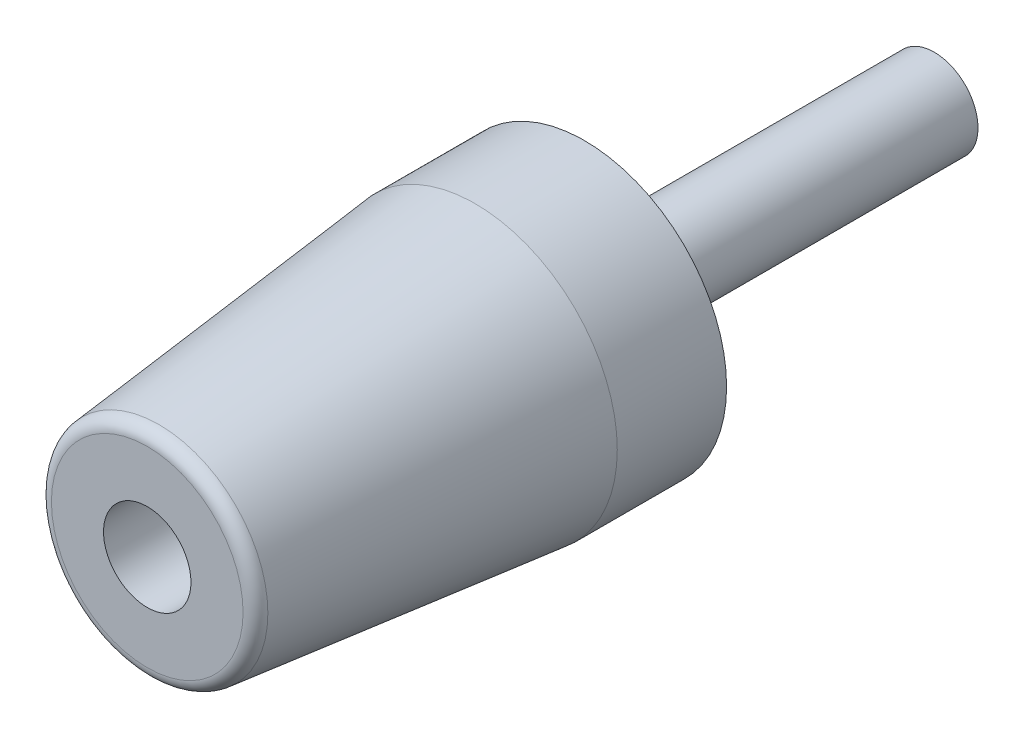
ISO-10303-21;
HEADER;
FILE_DESCRIPTION(('STEP AP214'),'2;1');
FILE_NAME('part.step','',(''),(''),'','','');
FILE_SCHEMA(('AUTOMOTIVE_DESIGN { 1 0 10303 214 1 1 1 1 }'));
ENDSEC;
DATA;
#1=APPLICATION_CONTEXT('core data for automotive mechanical design processes');
#2=APPLICATION_PROTOCOL_DEFINITION('international standard','automotive_design',2000,#1);
#3=PRODUCT_CONTEXT('',#1,'mechanical');
#4=PRODUCT('Part','Part','',(#3));
#5=PRODUCT_RELATED_PRODUCT_CATEGORY('part','',(#4));
#6=PRODUCT_DEFINITION_FORMATION('','',#4);
#7=PRODUCT_DEFINITION_CONTEXT('part definition',#1,'design');
#8=PRODUCT_DEFINITION('design','',#6,#7);
#9=PRODUCT_DEFINITION_SHAPE('','',#8);
#10=(LENGTH_UNIT() NAMED_UNIT(*) SI_UNIT(.MILLI.,.METRE.));
#11=(NAMED_UNIT(*) PLANE_ANGLE_UNIT() SI_UNIT($,.RADIAN.));
#12=(NAMED_UNIT(*) SI_UNIT($,.STERADIAN.) SOLID_ANGLE_UNIT());
#13=UNCERTAINTY_MEASURE_WITH_UNIT(LENGTH_MEASURE(1.E-05),#10,'distance_accuracy_value','');
#14=(GEOMETRIC_REPRESENTATION_CONTEXT(3) GLOBAL_UNCERTAINTY_ASSIGNED_CONTEXT((#13)) GLOBAL_UNIT_ASSIGNED_CONTEXT((#10,
#11,#12)) REPRESENTATION_CONTEXT('',''));
#15=CARTESIAN_POINT('',(0.,0.,0.));
#16=DIRECTION('',(0.,0.,1.));
#17=DIRECTION('',(1.,0.,0.));
#18=AXIS2_PLACEMENT_3D('',#15,#16,#17);
#19=CARTESIAN_POINT('',(0.,0.,21.));
#20=DIRECTION('',(0.,0.,-1.));
#21=DIRECTION('',(-1.,0.,0.));
#22=AXIS2_PLACEMENT_3D('',#19,#20,#21);
#23=CYLINDRICAL_SURFACE('',#22,6.5);
#24=CARTESIAN_POINT('',(0.,0.,21.));
#25=DIRECTION('',(0.,0.,1.));
#26=DIRECTION('',(1.,0.,0.));
#27=AXIS2_PLACEMENT_3D('',#24,#25,#26);
#28=CIRCLE('',#27,6.5);
#29=CARTESIAN_POINT('',(6.5,0.,21.));
#30=VERTEX_POINT('',#29);
#31=EDGE_CURVE('E53',#30,#30,#28,.T.);
#32=ORIENTED_EDGE('',*,*,#31,.F.);
#33=EDGE_LOOP('',(#32));
#34=FACE_BOUND('',#33,.T.);
#35=CARTESIAN_POINT('',(0.,0.,16.));
#36=DIRECTION('',(0.,0.,1.));
#37=DIRECTION('',(1.,0.,0.));
#38=AXIS2_PLACEMENT_3D('',#35,#36,#37);
#39=CIRCLE('',#38,6.5);
#40=CARTESIAN_POINT('',(6.5,0.,16.));
#41=VERTEX_POINT('',#40);
#42=EDGE_CURVE('E54',#41,#41,#39,.T.);
#43=ORIENTED_EDGE('',*,*,#42,.T.);
#44=EDGE_LOOP('',(#43));
#45=FACE_BOUND('',#44,.T.);
#46=ADVANCED_FACE('F33',(#34,#45),#23,.T.);
#47=CARTESIAN_POINT('',(0.,0.,16.));
#48=DIRECTION('',(0.,0.,1.));
#49=DIRECTION('',(1.,0.,0.));
#50=AXIS2_PLACEMENT_3D('',#47,#48,#49);
#51=PLANE('',#50);
#52=CARTESIAN_POINT('',(0.,0.,16.));
#53=DIRECTION('',(0.,0.,1.));
#54=DIRECTION('',(1.,0.,0.));
#55=AXIS2_PLACEMENT_3D('',#52,#53,#54);
#56=CIRCLE('',#55,2.);
#57=CARTESIAN_POINT('',(2.,0.,16.));
#58=VERTEX_POINT('',#57);
#59=EDGE_CURVE('E44',#58,#58,#56,.T.);
#60=ORIENTED_EDGE('',*,*,#59,.T.);
#61=EDGE_LOOP('',(#60));
#62=FACE_BOUND('',#61,.T.);
#63=ORIENTED_EDGE('',*,*,#42,.F.);
#64=EDGE_LOOP('',(#63));
#65=FACE_BOUND('',#64,.T.);
#66=ADVANCED_FACE('F86',(#62,#65),#51,.F.);
#67=CARTESIAN_POINT('',(0.,0.,0.));
#68=DIRECTION('',(0.,0.,1.));
#69=DIRECTION('',(1.,0.,0.));
#70=AXIS2_PLACEMENT_3D('',#67,#68,#69);
#71=PLANE('',#70);
#72=CARTESIAN_POINT('',(0.,0.,0.));
#73=DIRECTION('',(0.,0.,1.));
#74=DIRECTION('',(1.,0.,0.));
#75=AXIS2_PLACEMENT_3D('',#72,#73,#74);
#76=CIRCLE('',#75,2.);
#77=CARTESIAN_POINT('',(2.,0.,0.));
#78=VERTEX_POINT('',#77);
#79=EDGE_CURVE('E48',#78,#78,#76,.T.);
#80=ORIENTED_EDGE('',*,*,#79,.F.);
#81=EDGE_LOOP('',(#80));
#82=FACE_BOUND('',#81,.T.);
#83=ADVANCED_FACE('F91',(#82),#71,.F.);
#84=CARTESIAN_POINT('',(0.,0.,36.));
#85=DIRECTION('',(0.,0.,-1.));
#86=DIRECTION('',(-1.,0.,0.));
#87=AXIS2_PLACEMENT_3D('',#84,#85,#86);
#88=CYLINDRICAL_SURFACE('',#87,2.);
#89=ORIENTED_EDGE('',*,*,#79,.T.);
#90=EDGE_LOOP('',(#89));
#91=FACE_BOUND('',#90,.T.);
#92=ORIENTED_EDGE('',*,*,#59,.F.);
#93=EDGE_LOOP('',(#92));
#94=FACE_BOUND('',#93,.T.);
#95=ADVANCED_FACE('F81',(#91,#94),#88,.T.);
#96=CARTESIAN_POINT('',(0.,0.,21.));
#97=DIRECTION('',(0.,0.,-1.));
#98=DIRECTION('',(1.,0.,0.));
#99=AXIS2_PLACEMENT_3D('',#96,#97,#98);
#100=CONICAL_SURFACE('',#99,6.5,0.10471975511966);
#101=CARTESIAN_POINT('',(0.,0.,35.4627170779606));
#102=DIRECTION('',(0.,0.,-1.));
#103=DIRECTION('',(-1.,0.,0.));
#104=AXIS2_PLACEMENT_3D('',#101,#102,#103);
#105=CIRCLE('',#104,4.97990718165711);
#106=CARTESIAN_POINT('',(-4.97990718165711,0.,35.4627170779606));
#107=VERTEX_POINT('',#106);
#108=EDGE_CURVE('E10',#107,#107,#105,.T.);
#109=ORIENTED_EDGE('',*,*,#108,.T.);
#110=EDGE_LOOP('',(#109));
#111=FACE_BOUND('',#110,.T.);
#112=ORIENTED_EDGE('',*,*,#31,.T.);
#113=EDGE_LOOP('',(#112));
#114=FACE_BOUND('',#113,.T.);
#115=ADVANCED_FACE('F76',(#111,#114),#100,.T.);
#116=CARTESIAN_POINT('',(0.,0.,36.));
#117=DIRECTION('',(0.,0.,1.));
#118=DIRECTION('',(1.,0.,0.));
#119=AXIS2_PLACEMENT_3D('',#116,#117,#118);
#120=PLANE('',#119);
#121=CARTESIAN_POINT('',(0.,0.,36.));
#122=DIRECTION('',(0.,0.,1.));
#123=DIRECTION('',(1.,0.,0.));
#124=AXIS2_PLACEMENT_3D('',#121,#122,#123);
#125=CIRCLE('',#124,4.38319404443615);
#126=CARTESIAN_POINT('',(4.38319404443615,0.,36.));
#127=VERTEX_POINT('',#126);
#128=EDGE_CURVE('E40',#127,#127,#125,.T.);
#129=ORIENTED_EDGE('',*,*,#128,.T.);
#130=EDGE_LOOP('',(#129));
#131=FACE_BOUND('',#130,.T.);
#132=CARTESIAN_POINT('',(0.,0.,36.));
#133=DIRECTION('',(0.,0.,1.));
#134=DIRECTION('',(1.,0.,0.));
#135=AXIS2_PLACEMENT_3D('',#132,#133,#134);
#136=CIRCLE('',#135,2.);
#137=CARTESIAN_POINT('',(2.,0.,36.));
#138=VERTEX_POINT('',#137);
#139=EDGE_CURVE('E60',#138,#138,#136,.T.);
#140=ORIENTED_EDGE('',*,*,#139,.F.);
#141=EDGE_LOOP('',(#140));
#142=FACE_BOUND('',#141,.T.);
#143=ADVANCED_FACE('F71',(#131,#142),#120,.T.);
#144=CARTESIAN_POINT('',(0.,0.,23.));
#145=DIRECTION('',(0.,0.,1.));
#146=DIRECTION('',(1.,0.,0.));
#147=AXIS2_PLACEMENT_3D('',#144,#145,#146);
#148=CYLINDRICAL_SURFACE('',#147,2.);
#149=CARTESIAN_POINT('',(0.,0.,23.));
#150=DIRECTION('',(0.,0.,1.));
#151=DIRECTION('',(1.,0.,0.));
#152=AXIS2_PLACEMENT_3D('',#149,#150,#151);
#153=CIRCLE('',#152,2.);
#154=CARTESIAN_POINT('',(2.,0.,23.));
#155=VERTEX_POINT('',#154);
#156=EDGE_CURVE('E57',#155,#155,#153,.T.);
#157=CARTESIAN_POINT('',(2.,0.,23.));
#158=CARTESIAN_POINT('',(2.,0.,23.1354166666667));
#159=CARTESIAN_POINT('',(2.,0.,23.2708333333333));
#160=CARTESIAN_POINT('',(2.,0.,23.5416666666667));
#161=CARTESIAN_POINT('',(2.,0.,23.6770833333333));
#162=CARTESIAN_POINT('',(2.,0.,23.9479166666667));
#163=CARTESIAN_POINT('',(2.,0.,24.0833333333333));
#164=CARTESIAN_POINT('',(2.,0.,24.3541666666667));
#165=CARTESIAN_POINT('',(2.,0.,24.4895833333333));
#166=CARTESIAN_POINT('',(2.,0.,24.7604166666667));
#167=CARTESIAN_POINT('',(2.,0.,24.8958333333333));
#168=CARTESIAN_POINT('',(2.,0.,25.1666666666667));
#169=CARTESIAN_POINT('',(2.,0.,25.3020833333333));
#170=CARTESIAN_POINT('',(2.,0.,25.5729166666667));
#171=CARTESIAN_POINT('',(2.,0.,25.7083333333333));
#172=CARTESIAN_POINT('',(2.,0.,25.9791666666667));
#173=CARTESIAN_POINT('',(2.,0.,26.1145833333333));
#174=CARTESIAN_POINT('',(2.,0.,26.3854166666667));
#175=CARTESIAN_POINT('',(2.,0.,26.5208333333333));
#176=CARTESIAN_POINT('',(2.,0.,26.7916666666667));
#177=CARTESIAN_POINT('',(2.,0.,26.9270833333333));
#178=CARTESIAN_POINT('',(2.,0.,27.1979166666667));
#179=CARTESIAN_POINT('',(2.,0.,27.3333333333333));
#180=CARTESIAN_POINT('',(2.,0.,27.6041666666667));
#181=CARTESIAN_POINT('',(2.,0.,27.7395833333333));
#182=CARTESIAN_POINT('',(2.,0.,28.0104166666667));
#183=CARTESIAN_POINT('',(2.,0.,28.1458333333333));
#184=CARTESIAN_POINT('',(2.,0.,28.4166666666667));
#185=CARTESIAN_POINT('',(2.,0.,28.5520833333333));
#186=CARTESIAN_POINT('',(2.,0.,28.8229166666667));
#187=CARTESIAN_POINT('',(2.,0.,28.9583333333333));
#188=CARTESIAN_POINT('',(2.,0.,29.2291666666667));
#189=CARTESIAN_POINT('',(2.,0.,29.3645833333333));
#190=CARTESIAN_POINT('',(2.,0.,29.6354166666667));
#191=CARTESIAN_POINT('',(2.,0.,29.7708333333333));
#192=CARTESIAN_POINT('',(2.,0.,30.0416666666667));
#193=CARTESIAN_POINT('',(2.,0.,30.1770833333333));
#194=CARTESIAN_POINT('',(2.,0.,30.4479166666667));
#195=CARTESIAN_POINT('',(2.,0.,30.5833333333333));
#196=CARTESIAN_POINT('',(2.,0.,30.8541666666667));
#197=CARTESIAN_POINT('',(2.,0.,30.9895833333333));
#198=CARTESIAN_POINT('',(2.,0.,31.2604166666667));
#199=CARTESIAN_POINT('',(2.,0.,31.3958333333333));
#200=CARTESIAN_POINT('',(2.,0.,31.6666666666667));
#201=CARTESIAN_POINT('',(2.,0.,31.8020833333333));
#202=CARTESIAN_POINT('',(2.,0.,32.0729166666667));
#203=CARTESIAN_POINT('',(2.,0.,32.2083333333333));
#204=CARTESIAN_POINT('',(2.,0.,32.4791666666667));
#205=CARTESIAN_POINT('',(2.,0.,32.6145833333333));
#206=CARTESIAN_POINT('',(2.,0.,32.8854166666667));
#207=CARTESIAN_POINT('',(2.,0.,33.0208333333333));
#208=CARTESIAN_POINT('',(2.,0.,33.2916666666667));
#209=CARTESIAN_POINT('',(2.,0.,33.4270833333333));
#210=CARTESIAN_POINT('',(2.,0.,33.6979166666667));
#211=CARTESIAN_POINT('',(2.,0.,33.8333333333333));
#212=CARTESIAN_POINT('',(2.,0.,34.1041666666667));
#213=CARTESIAN_POINT('',(2.,0.,34.2395833333333));
#214=CARTESIAN_POINT('',(2.,0.,34.5104166666667));
#215=CARTESIAN_POINT('',(2.,0.,34.6458333333333));
#216=CARTESIAN_POINT('',(2.,0.,34.9166666666667));
#217=CARTESIAN_POINT('',(2.,0.,35.0520833333333));
#218=CARTESIAN_POINT('',(2.,0.,35.3229166666667));
#219=CARTESIAN_POINT('',(2.,0.,35.4583333333333));
#220=CARTESIAN_POINT('',(2.,0.,35.7291666666667));
#221=CARTESIAN_POINT('',(2.,0.,35.8645833333333));
#222=CARTESIAN_POINT('',(2.,0.,36.));
#223=B_SPLINE_CURVE_WITH_KNOTS('',3,(#157,#158,#159,#160,#161,#162,#163,#164,#165,#166,#167,
#168,#169,#170,#171,#172,#173,#174,#175,#176,#177,#178,#179,#180,#181,#182,#183,#184,#185,#186,
#187,#188,#189,#190,#191,#192,#193,#194,#195,#196,#197,#198,#199,#200,#201,#202,#203,#204,#205,
#206,#207,#208,#209,#210,#211,#212,#213,#214,#215,#216,#217,#218,#219,#220,#221,#222),
.UNSPECIFIED.,.F.,.F.,(4,2,2,2,2,2,2,2,2,2,2,2,2,2,2,2,2,2,2,2,2,2,2,2,2,2,2,2,2,2,2,2,4),(0.,
0.406249999999997,0.812499999999997,1.21875,1.625,2.03125,2.4375,2.84375,3.25,3.65625,4.0625,
4.46875,4.875,5.28125,5.6875,6.09374999999999,6.5,6.90625,7.3125,7.71875,8.125,8.53125,
8.93749999999999,9.34375,9.74999999999999,10.15625,10.5625,10.96875,11.375,11.78125,12.1875,
12.59375,13.),.UNSPECIFIED.);
#224=EDGE_CURVE('BSEAM68',#155,#138,#223,.T.);
#225=ORIENTED_EDGE('',*,*,#156,.F.);
#226=ORIENTED_EDGE('',*,*,#139,.T.);
#227=ORIENTED_EDGE('',*,*,#224,.T.);
#228=ORIENTED_EDGE('',*,*,#224,.F.);
#229=EDGE_LOOP('',(#225,#227,#226,#228));
#230=FACE_BOUND('',#229,.T.);
#231=ADVANCED_FACE('F68',(#230),#148,.F.);
#232=CARTESIAN_POINT('',(0.,0.,23.));
#233=DIRECTION('',(0.,0.,1.));
#234=DIRECTION('',(1.,0.,0.));
#235=AXIS2_PLACEMENT_3D('',#232,#233,#234);
#236=PLANE('',#235);
#237=ORIENTED_EDGE('',*,*,#156,.T.);
#238=EDGE_LOOP('',(#237));
#239=FACE_BOUND('',#238,.T.);
#240=ADVANCED_FACE('F66',(#239),#236,.T.);
#241=CARTESIAN_POINT('',(0.,0.,35.4));
#242=DIRECTION('',(0.,0.,1.));
#243=DIRECTION('',(1.,0.,0.));
#244=AXIS2_PLACEMENT_3D('',#241,#242,#243);
#245=TOROIDAL_SURFACE('',#244,4.38319404443615,0.6);
#246=ORIENTED_EDGE('',*,*,#108,.F.);
#247=EDGE_LOOP('',(#246));
#248=FACE_BOUND('',#247,.T.);
#249=ORIENTED_EDGE('',*,*,#128,.F.);
#250=EDGE_LOOP('',(#249));
#251=FACE_BOUND('',#250,.T.);
#252=ADVANCED_FACE('F35',(#248,#251),#245,.T.);
#253=CLOSED_SHELL('',(#46,#66,#83,#95,#115,#143,#231,#240,#252));
#254=MANIFOLD_SOLID_BREP('B2',#253);
#255=ADVANCED_BREP_SHAPE_REPRESENTATION('',(#18,#254),#14);
#256=SHAPE_DEFINITION_REPRESENTATION(#9,#255);
ENDSEC;
END-ISO-10303-21;
